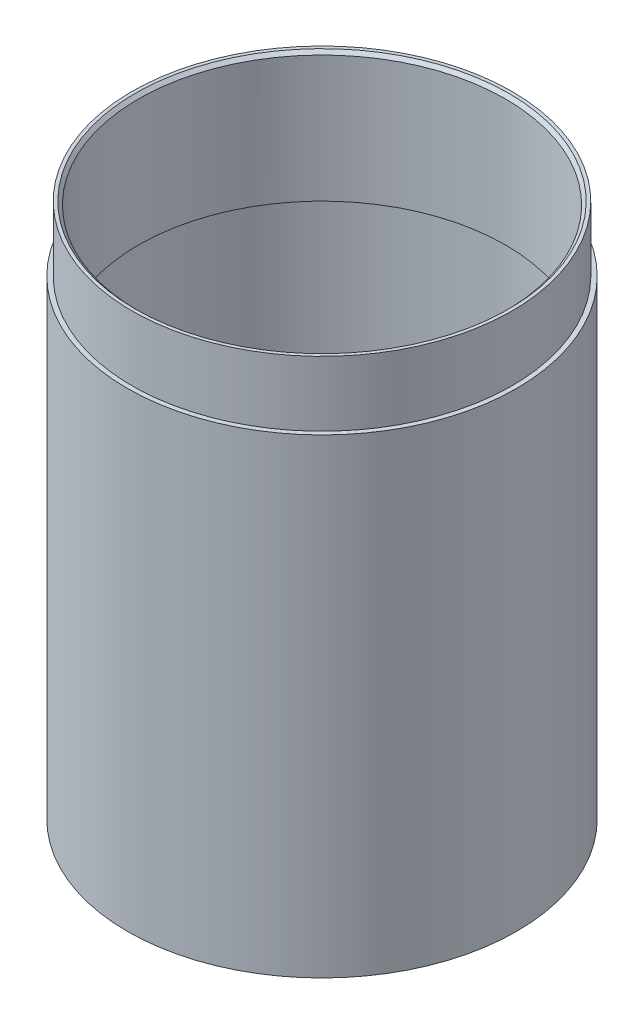
ISO-10303-21;
HEADER;
FILE_DESCRIPTION(('STEP AP214'),'2;1');
FILE_NAME('part.step','',(''),(''),'','','');
FILE_SCHEMA(('AUTOMOTIVE_DESIGN { 1 0 10303 214 1 1 1 1 }'));
ENDSEC;
DATA;
#1=APPLICATION_CONTEXT('core data for automotive mechanical design processes');
#2=APPLICATION_PROTOCOL_DEFINITION('international standard','automotive_design',2000,#1);
#3=PRODUCT_CONTEXT('',#1,'mechanical');
#4=PRODUCT('Part','Part','',(#3));
#5=PRODUCT_RELATED_PRODUCT_CATEGORY('part','',(#4));
#6=PRODUCT_DEFINITION_FORMATION('','',#4);
#7=PRODUCT_DEFINITION_CONTEXT('part definition',#1,'design');
#8=PRODUCT_DEFINITION('design','',#6,#7);
#9=PRODUCT_DEFINITION_SHAPE('','',#8);
#10=(LENGTH_UNIT() NAMED_UNIT(*) SI_UNIT(.MILLI.,.METRE.));
#11=(NAMED_UNIT(*) PLANE_ANGLE_UNIT() SI_UNIT($,.RADIAN.));
#12=(NAMED_UNIT(*) SI_UNIT($,.STERADIAN.) SOLID_ANGLE_UNIT());
#13=UNCERTAINTY_MEASURE_WITH_UNIT(LENGTH_MEASURE(1.E-05),#10,'distance_accuracy_value','');
#14=(GEOMETRIC_REPRESENTATION_CONTEXT(3) GLOBAL_UNCERTAINTY_ASSIGNED_CONTEXT((#13)) GLOBAL_UNIT_ASSIGNED_CONTEXT((#10,
#11,#12)) REPRESENTATION_CONTEXT('',''));
#15=CARTESIAN_POINT('',(0.,0.,0.));
#16=DIRECTION('',(0.,0.,1.));
#17=DIRECTION('',(1.,0.,0.));
#18=AXIS2_PLACEMENT_3D('',#15,#16,#17);
#19=CARTESIAN_POINT('',(35.941,30.6268918315211,0.));
#20=DIRECTION('',(0.,1.,0.));
#21=DIRECTION('',(0.,0.,1.));
#22=AXIS2_PLACEMENT_3D('',#19,#20,#21);
#23=PLANE('',#22);
#24=CARTESIAN_POINT('',(0.,30.6268918315211,0.));
#25=DIRECTION('',(0.,1.,0.));
#26=DIRECTION('',(0.,0.,1.));
#27=AXIS2_PLACEMENT_3D('',#24,#25,#26);
#28=CIRCLE('',#27,36.576);
#29=CARTESIAN_POINT('',(0.,30.6268918315211,36.576));
#30=VERTEX_POINT('',#29);
#31=EDGE_CURVE('E51',#30,#30,#28,.F.);
#32=ORIENTED_EDGE('',*,*,#31,.T.);
#33=EDGE_LOOP('',(#32));
#34=FACE_BOUND('',#33,.T.);
#35=CARTESIAN_POINT('',(0.,30.6268918315211,0.));
#36=DIRECTION('',(0.,-1.,0.));
#37=DIRECTION('',(0.,0.,-1.));
#38=AXIS2_PLACEMENT_3D('',#35,#36,#37);
#39=CIRCLE('',#38,37.211);
#40=CARTESIAN_POINT('',(0.,30.6268918315211,-37.211));
#41=VERTEX_POINT('',#40);
#42=EDGE_CURVE('E67',#41,#41,#39,.T.);
#43=ORIENTED_EDGE('',*,*,#42,.F.);
#44=EDGE_LOOP('',(#43));
#45=FACE_BOUND('',#44,.T.);
#46=ADVANCED_FACE('F42',(#34,#45),#23,.T.);
#47=CARTESIAN_POINT('',(0.,-31.3895818395062,0.));
#48=DIRECTION('',(0.,-1.,0.));
#49=DIRECTION('',(0.,0.,-1.));
#50=AXIS2_PLACEMENT_3D('',#47,#48,#49);
#51=CYLINDRICAL_SURFACE('',#50,37.211);
#52=ORIENTED_EDGE('',*,*,#42,.T.);
#53=EDGE_LOOP('',(#52));
#54=FACE_BOUND('',#53,.T.);
#55=CARTESIAN_POINT('',(0.,17.9268918315211,0.));
#56=DIRECTION('',(0.,-1.,0.));
#57=DIRECTION('',(0.,0.,-1.));
#58=AXIS2_PLACEMENT_3D('',#55,#56,#57);
#59=CIRCLE('',#58,37.211);
#60=CARTESIAN_POINT('',(0.,17.9268918315211,-37.211));
#61=VERTEX_POINT('',#60);
#62=EDGE_CURVE('E71',#61,#61,#59,.T.);
#63=ORIENTED_EDGE('',*,*,#62,.F.);
#64=EDGE_LOOP('',(#63));
#65=FACE_BOUND('',#64,.T.);
#66=ADVANCED_FACE('F109',(#54,#65),#51,.T.);
#67=CARTESIAN_POINT('',(37.211,17.9268918315211,0.));
#68=DIRECTION('',(0.,1.,0.));
#69=DIRECTION('',(0.,0.,1.));
#70=AXIS2_PLACEMENT_3D('',#67,#68,#69);
#71=PLANE('',#70);
#72=ORIENTED_EDGE('',*,*,#62,.T.);
#73=EDGE_LOOP('',(#72));
#74=FACE_BOUND('',#73,.T.);
#75=CARTESIAN_POINT('',(0.,17.9268918315211,0.));
#76=DIRECTION('',(0.,-1.,0.));
#77=DIRECTION('',(0.,0.,-1.));
#78=AXIS2_PLACEMENT_3D('',#75,#76,#77);
#79=CIRCLE('',#78,38.1);
#80=CARTESIAN_POINT('',(0.,17.9268918315211,-38.1));
#81=VERTEX_POINT('',#80);
#82=EDGE_CURVE('E75',#81,#81,#79,.T.);
#83=ORIENTED_EDGE('',*,*,#82,.F.);
#84=EDGE_LOOP('',(#83));
#85=FACE_BOUND('',#84,.T.);
#86=ADVANCED_FACE('F114',(#74,#85),#71,.T.);
#87=CARTESIAN_POINT('',(0.,-31.3895818395062,0.));
#88=DIRECTION('',(0.,-1.,0.));
#89=DIRECTION('',(0.,0.,-1.));
#90=AXIS2_PLACEMENT_3D('',#87,#88,#89);
#91=CYLINDRICAL_SURFACE('',#90,38.1);
#92=ORIENTED_EDGE('',*,*,#82,.T.);
#93=EDGE_LOOP('',(#92));
#94=FACE_BOUND('',#93,.T.);
#95=CARTESIAN_POINT('',(0.,-74.1481081684789,0.));
#96=DIRECTION('',(0.,-1.,0.));
#97=DIRECTION('',(0.,0.,-1.));
#98=AXIS2_PLACEMENT_3D('',#95,#96,#97);
#99=CIRCLE('',#98,38.1);
#100=CARTESIAN_POINT('',(0.,-74.1481081684789,-38.1));
#101=VERTEX_POINT('',#100);
#102=EDGE_CURVE('E79',#101,#101,#99,.T.);
#103=ORIENTED_EDGE('',*,*,#102,.F.);
#104=EDGE_LOOP('',(#103));
#105=FACE_BOUND('',#104,.T.);
#106=ADVANCED_FACE('F136',(#94,#105),#91,.T.);
#107=CARTESIAN_POINT('',(36.703,-74.1481081684789,0.));
#108=DIRECTION('',(0.,-1.,0.));
#109=DIRECTION('',(0.,0.,-1.));
#110=AXIS2_PLACEMENT_3D('',#107,#108,#109);
#111=PLANE('',#110);
#112=CARTESIAN_POINT('',(0.,-74.1481081684789,0.));
#113=DIRECTION('',(0.,-1.,0.));
#114=DIRECTION('',(0.,0.,-1.));
#115=AXIS2_PLACEMENT_3D('',#112,#113,#114);
#116=CIRCLE('',#115,37.338);
#117=CARTESIAN_POINT('',(0.,-74.1481081684789,-37.338));
#118=VERTEX_POINT('',#117);
#119=EDGE_CURVE('E56',#118,#118,#116,.F.);
#120=ORIENTED_EDGE('',*,*,#119,.T.);
#121=EDGE_LOOP('',(#120));
#122=FACE_BOUND('',#121,.T.);
#123=ORIENTED_EDGE('',*,*,#102,.T.);
#124=EDGE_LOOP('',(#123));
#125=FACE_BOUND('',#124,.T.);
#126=ADVANCED_FACE('F105',(#122,#125),#111,.T.);
#127=CARTESIAN_POINT('',(0.,-31.3895818395062,0.));
#128=DIRECTION('',(0.,-1.,0.));
#129=DIRECTION('',(0.,0.,-1.));
#130=AXIS2_PLACEMENT_3D('',#127,#128,#129);
#131=CYLINDRICAL_SURFACE('',#130,36.703);
#132=CARTESIAN_POINT('',(0.,-73.5131081684789,0.));
#133=DIRECTION('',(0.,-1.,0.));
#134=DIRECTION('',(0.,0.,-1.));
#135=AXIS2_PLACEMENT_3D('',#132,#133,#134);
#136=CIRCLE('',#135,36.703);
#137=CARTESIAN_POINT('',(0.,-73.5131081684789,-36.703));
#138=VERTEX_POINT('',#137);
#139=EDGE_CURVE('E61',#138,#138,#136,.T.);
#140=ORIENTED_EDGE('',*,*,#139,.T.);
#141=EDGE_LOOP('',(#140));
#142=FACE_BOUND('',#141,.T.);
#143=CARTESIAN_POINT('',(0.,5.22689183152111,0.));
#144=DIRECTION('',(0.,-1.,0.));
#145=DIRECTION('',(0.,0.,-1.));
#146=AXIS2_PLACEMENT_3D('',#143,#144,#145);
#147=CIRCLE('',#146,36.703);
#148=CARTESIAN_POINT('',(0.,5.22689183152111,-36.703));
#149=VERTEX_POINT('',#148);
#150=EDGE_CURVE('E83',#149,#149,#147,.T.);
#151=ORIENTED_EDGE('',*,*,#150,.F.);
#152=EDGE_LOOP('',(#151));
#153=FACE_BOUND('',#152,.T.);
#154=ADVANCED_FACE('F96',(#142,#153),#131,.F.);
#155=CARTESIAN_POINT('',(35.941,5.22689183152111,0.));
#156=DIRECTION('',(0.,-1.,0.));
#157=DIRECTION('',(0.,0.,-1.));
#158=AXIS2_PLACEMENT_3D('',#155,#156,#157);
#159=PLANE('',#158);
#160=ORIENTED_EDGE('',*,*,#150,.T.);
#161=EDGE_LOOP('',(#160));
#162=FACE_BOUND('',#161,.T.);
#163=CARTESIAN_POINT('',(0.,5.22689183152111,0.));
#164=DIRECTION('',(0.,-1.,0.));
#165=DIRECTION('',(0.,0.,-1.));
#166=AXIS2_PLACEMENT_3D('',#163,#164,#165);
#167=CIRCLE('',#166,35.941);
#168=CARTESIAN_POINT('',(0.,5.22689183152111,-35.941));
#169=VERTEX_POINT('',#168);
#170=EDGE_CURVE('E87',#169,#169,#167,.T.);
#171=ORIENTED_EDGE('',*,*,#170,.F.);
#172=EDGE_LOOP('',(#171));
#173=FACE_BOUND('',#172,.T.);
#174=ADVANCED_FACE('F94',(#162,#173),#159,.T.);
#175=CARTESIAN_POINT('',(0.,-31.3895818395062,0.));
#176=DIRECTION('',(0.,-1.,0.));
#177=DIRECTION('',(0.,0.,-1.));
#178=AXIS2_PLACEMENT_3D('',#175,#176,#177);
#179=CYLINDRICAL_SURFACE('',#178,35.941);
#180=CARTESIAN_POINT('',(0.,29.9918918315211,0.));
#181=DIRECTION('',(0.,1.,0.));
#182=DIRECTION('',(0.,0.,1.));
#183=AXIS2_PLACEMENT_3D('',#180,#181,#182);
#184=CIRCLE('',#183,35.941);
#185=CARTESIAN_POINT('',(0.,29.9918918315211,35.941));
#186=VERTEX_POINT('',#185);
#187=EDGE_CURVE('E10',#186,#186,#184,.T.);
#188=ORIENTED_EDGE('',*,*,#187,.T.);
#189=EDGE_LOOP('',(#188));
#190=FACE_BOUND('',#189,.T.);
#191=ORIENTED_EDGE('',*,*,#170,.T.);
#192=EDGE_LOOP('',(#191));
#193=FACE_BOUND('',#192,.T.);
#194=ADVANCED_FACE('F92',(#190,#193),#179,.F.);
#195=CARTESIAN_POINT('',(0.,-73.5131081684789,0.));
#196=DIRECTION('',(0.,-1.,0.));
#197=DIRECTION('',(0.,0.,-1.));
#198=AXIS2_PLACEMENT_3D('',#195,#196,#197);
#199=CONICAL_SURFACE('',#198,36.703,0.785398163397448);
#200=ORIENTED_EDGE('',*,*,#119,.F.);
#201=EDGE_LOOP('',(#200));
#202=FACE_BOUND('',#201,.T.);
#203=ORIENTED_EDGE('',*,*,#139,.F.);
#204=EDGE_LOOP('',(#203));
#205=FACE_BOUND('',#204,.T.);
#206=ADVANCED_FACE('F103',(#202,#205),#199,.F.);
#207=CARTESIAN_POINT('',(0.,30.6268918315211,0.));
#208=DIRECTION('',(0.,1.,0.));
#209=DIRECTION('',(0.,0.,1.));
#210=AXIS2_PLACEMENT_3D('',#207,#208,#209);
#211=CONICAL_SURFACE('',#210,36.576,0.785398163397459);
#212=ORIENTED_EDGE('',*,*,#187,.F.);
#213=EDGE_LOOP('',(#212));
#214=FACE_BOUND('',#213,.T.);
#215=ORIENTED_EDGE('',*,*,#31,.F.);
#216=EDGE_LOOP('',(#215));
#217=FACE_BOUND('',#216,.T.);
#218=ADVANCED_FACE('F45',(#214,#217),#211,.F.);
#219=CLOSED_SHELL('',(#46,#66,#86,#106,#126,#154,#174,#194,#206,#218));
#220=MANIFOLD_SOLID_BREP('B2',#219);
#221=ADVANCED_BREP_SHAPE_REPRESENTATION('',(#18,#220),#14);
#222=SHAPE_DEFINITION_REPRESENTATION(#9,#221);
ENDSEC;
END-ISO-10303-21;
